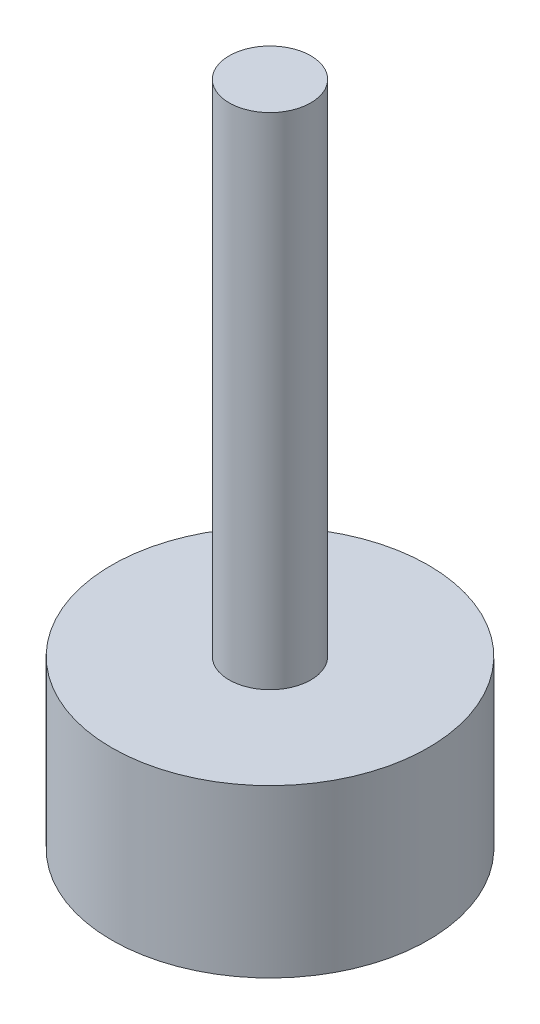
ISO-10303-21;
HEADER;
FILE_DESCRIPTION(('STEP AP214'),'2;1');
FILE_NAME('part.step','',(''),(''),'','','');
FILE_SCHEMA(('AUTOMOTIVE_DESIGN { 1 0 10303 214 1 1 1 1 }'));
ENDSEC;
DATA;
#1=APPLICATION_CONTEXT('core data for automotive mechanical design processes');
#2=APPLICATION_PROTOCOL_DEFINITION('international standard','automotive_design',2000,#1);
#3=PRODUCT_CONTEXT('',#1,'mechanical');
#4=PRODUCT('Part','Part','',(#3));
#5=PRODUCT_RELATED_PRODUCT_CATEGORY('part','',(#4));
#6=PRODUCT_DEFINITION_FORMATION('','',#4);
#7=PRODUCT_DEFINITION_CONTEXT('part definition',#1,'design');
#8=PRODUCT_DEFINITION('design','',#6,#7);
#9=PRODUCT_DEFINITION_SHAPE('','',#8);
#10=(LENGTH_UNIT() NAMED_UNIT(*) SI_UNIT(.MILLI.,.METRE.));
#11=(NAMED_UNIT(*) PLANE_ANGLE_UNIT() SI_UNIT($,.RADIAN.));
#12=(NAMED_UNIT(*) SI_UNIT($,.STERADIAN.) SOLID_ANGLE_UNIT());
#13=UNCERTAINTY_MEASURE_WITH_UNIT(LENGTH_MEASURE(1.E-05),#10,'distance_accuracy_value','');
#14=(GEOMETRIC_REPRESENTATION_CONTEXT(3) GLOBAL_UNCERTAINTY_ASSIGNED_CONTEXT((#13)) GLOBAL_UNIT_ASSIGNED_CONTEXT((#10,
#11,#12)) REPRESENTATION_CONTEXT('',''));
#15=CARTESIAN_POINT('',(0.,0.,0.));
#16=DIRECTION('',(0.,0.,1.));
#17=DIRECTION('',(1.,0.,0.));
#18=AXIS2_PLACEMENT_3D('',#15,#16,#17);
#19=CARTESIAN_POINT('',(0.,12.7,0.));
#20=DIRECTION('',(0.,-1.,0.));
#21=DIRECTION('',(0.,0.,-1.));
#22=AXIS2_PLACEMENT_3D('',#19,#20,#21);
#23=CYLINDRICAL_SURFACE('',#22,12.065);
#24=CARTESIAN_POINT('',(0.,12.7,0.));
#25=DIRECTION('',(0.,1.,0.));
#26=DIRECTION('',(0.,0.,1.));
#27=AXIS2_PLACEMENT_3D('',#24,#25,#26);
#28=CIRCLE('',#27,12.065);
#29=CARTESIAN_POINT('',(0.,12.7,12.065));
#30=VERTEX_POINT('',#29);
#31=EDGE_CURVE('E51',#30,#30,#28,.T.);
#32=ORIENTED_EDGE('',*,*,#31,.F.);
#33=EDGE_LOOP('',(#32));
#34=FACE_BOUND('',#33,.T.);
#35=CARTESIAN_POINT('',(0.,0.,0.));
#36=DIRECTION('',(0.,1.,0.));
#37=DIRECTION('',(0.,0.,1.));
#38=AXIS2_PLACEMENT_3D('',#35,#36,#37);
#39=CIRCLE('',#38,12.065);
#40=CARTESIAN_POINT('',(0.,0.,12.065));
#41=VERTEX_POINT('',#40);
#42=EDGE_CURVE('E46',#41,#41,#39,.T.);
#43=ORIENTED_EDGE('',*,*,#42,.T.);
#44=EDGE_LOOP('',(#43));
#45=FACE_BOUND('',#44,.T.);
#46=ADVANCED_FACE('F43',(#34,#45),#23,.T.);
#47=CARTESIAN_POINT('',(0.,12.7,0.));
#48=DIRECTION('',(0.,1.,0.));
#49=DIRECTION('',(0.,0.,1.));
#50=AXIS2_PLACEMENT_3D('',#47,#48,#49);
#51=PLANE('',#50);
#52=CARTESIAN_POINT('',(0.,12.7,0.));
#53=DIRECTION('',(0.,1.,0.));
#54=DIRECTION('',(0.,0.,1.));
#55=AXIS2_PLACEMENT_3D('',#52,#53,#54);
#56=CIRCLE('',#55,3.1115);
#57=CARTESIAN_POINT('',(0.,12.7,-3.1115));
#58=VERTEX_POINT('',#57);
#59=EDGE_CURVE('E10',#58,#58,#56,.T.);
#60=ORIENTED_EDGE('',*,*,#59,.F.);
#61=EDGE_LOOP('',(#60));
#62=FACE_BOUND('',#61,.T.);
#63=ORIENTED_EDGE('',*,*,#31,.T.);
#64=EDGE_LOOP('',(#63));
#65=FACE_BOUND('',#64,.T.);
#66=ADVANCED_FACE('F71',(#62,#65),#51,.T.);
#67=CARTESIAN_POINT('',(0.,0.,0.));
#68=DIRECTION('',(0.,1.,0.));
#69=DIRECTION('',(0.,0.,1.));
#70=AXIS2_PLACEMENT_3D('',#67,#68,#69);
#71=PLANE('',#70);
#72=ORIENTED_EDGE('',*,*,#42,.F.);
#73=EDGE_LOOP('',(#72));
#74=FACE_BOUND('',#73,.T.);
#75=ADVANCED_FACE('F68',(#74),#71,.F.);
#76=CARTESIAN_POINT('',(0.,50.8,0.));
#77=DIRECTION('',(0.,-1.,0.));
#78=DIRECTION('',(0.,0.,-1.));
#79=AXIS2_PLACEMENT_3D('',#76,#77,#78);
#80=CYLINDRICAL_SURFACE('',#79,3.1115);
#81=CARTESIAN_POINT('',(0.,50.8,0.));
#82=DIRECTION('',(0.,1.,0.));
#83=DIRECTION('',(0.,0.,1.));
#84=AXIS2_PLACEMENT_3D('',#81,#82,#83);
#85=CIRCLE('',#84,3.1115);
#86=CARTESIAN_POINT('',(0.,50.8,-3.1115));
#87=VERTEX_POINT('',#86);
#88=EDGE_CURVE('E58',#87,#87,#85,.T.);
#89=CARTESIAN_POINT('',(0.,50.8,-3.1115));
#90=CARTESIAN_POINT('',(0.,50.403125,-3.1115));
#91=CARTESIAN_POINT('',(0.,50.00625,-3.1115));
#92=CARTESIAN_POINT('',(0.,49.2125,-3.1115));
#93=CARTESIAN_POINT('',(0.,48.815625,-3.1115));
#94=CARTESIAN_POINT('',(0.,48.021875,-3.1115));
#95=CARTESIAN_POINT('',(0.,47.625,-3.1115));
#96=CARTESIAN_POINT('',(0.,46.83125,-3.1115));
#97=CARTESIAN_POINT('',(0.,46.434375,-3.1115));
#98=CARTESIAN_POINT('',(0.,45.640625,-3.1115));
#99=CARTESIAN_POINT('',(0.,45.24375,-3.1115));
#100=CARTESIAN_POINT('',(0.,44.45,-3.1115));
#101=CARTESIAN_POINT('',(0.,44.053125,-3.1115));
#102=CARTESIAN_POINT('',(0.,43.259375,-3.1115));
#103=CARTESIAN_POINT('',(0.,42.8625,-3.1115));
#104=CARTESIAN_POINT('',(0.,42.06875,-3.1115));
#105=CARTESIAN_POINT('',(0.,41.671875,-3.1115));
#106=CARTESIAN_POINT('',(0.,40.878125,-3.1115));
#107=CARTESIAN_POINT('',(0.,40.48125,-3.1115));
#108=CARTESIAN_POINT('',(0.,39.6875,-3.1115));
#109=CARTESIAN_POINT('',(0.,39.290625,-3.1115));
#110=CARTESIAN_POINT('',(0.,38.496875,-3.1115));
#111=CARTESIAN_POINT('',(0.,38.1,-3.1115));
#112=CARTESIAN_POINT('',(0.,37.30625,-3.1115));
#113=CARTESIAN_POINT('',(0.,36.909375,-3.1115));
#114=CARTESIAN_POINT('',(0.,36.115625,-3.1115));
#115=CARTESIAN_POINT('',(0.,35.71875,-3.1115));
#116=CARTESIAN_POINT('',(0.,34.925,-3.1115));
#117=CARTESIAN_POINT('',(0.,34.528125,-3.1115));
#118=CARTESIAN_POINT('',(0.,33.734375,-3.1115));
#119=CARTESIAN_POINT('',(0.,33.3375,-3.1115));
#120=CARTESIAN_POINT('',(0.,32.54375,-3.1115));
#121=CARTESIAN_POINT('',(0.,32.146875,-3.1115));
#122=CARTESIAN_POINT('',(0.,31.353125,-3.1115));
#123=CARTESIAN_POINT('',(0.,30.95625,-3.1115));
#124=CARTESIAN_POINT('',(0.,30.1625,-3.1115));
#125=CARTESIAN_POINT('',(0.,29.765625,-3.1115));
#126=CARTESIAN_POINT('',(0.,28.971875,-3.1115));
#127=CARTESIAN_POINT('',(0.,28.575,-3.1115));
#128=CARTESIAN_POINT('',(0.,27.78125,-3.1115));
#129=CARTESIAN_POINT('',(0.,27.384375,-3.1115));
#130=CARTESIAN_POINT('',(0.,26.590625,-3.1115));
#131=CARTESIAN_POINT('',(0.,26.19375,-3.1115));
#132=CARTESIAN_POINT('',(0.,25.4,-3.1115));
#133=CARTESIAN_POINT('',(0.,25.003125,-3.1115));
#134=CARTESIAN_POINT('',(0.,24.209375,-3.1115));
#135=CARTESIAN_POINT('',(0.,23.8125,-3.1115));
#136=CARTESIAN_POINT('',(0.,23.01875,-3.1115));
#137=CARTESIAN_POINT('',(0.,22.621875,-3.1115));
#138=CARTESIAN_POINT('',(0.,21.828125,-3.1115));
#139=CARTESIAN_POINT('',(0.,21.43125,-3.1115));
#140=CARTESIAN_POINT('',(0.,20.6375,-3.1115));
#141=CARTESIAN_POINT('',(0.,20.240625,-3.1115));
#142=CARTESIAN_POINT('',(0.,19.446875,-3.1115));
#143=CARTESIAN_POINT('',(0.,19.05,-3.1115));
#144=CARTESIAN_POINT('',(0.,18.25625,-3.1115));
#145=CARTESIAN_POINT('',(0.,17.859375,-3.1115));
#146=CARTESIAN_POINT('',(0.,17.065625,-3.1115));
#147=CARTESIAN_POINT('',(0.,16.66875,-3.1115));
#148=CARTESIAN_POINT('',(0.,15.875,-3.1115));
#149=CARTESIAN_POINT('',(0.,15.478125,-3.1115));
#150=CARTESIAN_POINT('',(0.,14.684375,-3.1115));
#151=CARTESIAN_POINT('',(0.,14.2875,-3.1115));
#152=CARTESIAN_POINT('',(0.,13.49375,-3.1115));
#153=CARTESIAN_POINT('',(0.,13.096875,-3.1115));
#154=CARTESIAN_POINT('',(0.,12.7,-3.1115));
#155=B_SPLINE_CURVE_WITH_KNOTS('',3,(#89,#90,#91,#92,#93,#94,#95,#96,#97,#98,#99,#100,#101,#102,
#103,#104,#105,#106,#107,#108,#109,#110,#111,#112,#113,#114,#115,#116,#117,#118,#119,#120,#121,
#122,#123,#124,#125,#126,#127,#128,#129,#130,#131,#132,#133,#134,#135,#136,#137,#138,#139,#140,
#141,#142,#143,#144,#145,#146,#147,#148,#149,#150,#151,#152,#153,#154),.UNSPECIFIED.,.F.,.F.,(4,
2,2,2,2,2,2,2,2,2,2,2,2,2,2,2,2,2,2,2,2,2,2,2,2,2,2,2,2,2,2,2,4),(0.,1.190625,2.38125,3.571875,
4.7625,5.953125,7.14375,8.334375,9.52500000000001,10.715625,11.90625,13.096875,14.2875,
15.478125,16.66875,17.859375,19.05,20.240625,21.43125,22.621875,23.8125,25.003125,26.19375,
27.384375,28.575,29.765625,30.95625,32.146875,33.3375,34.528125,35.71875,36.909375,38.1),.UNSPECIFIED.);
#156=EDGE_CURVE('BSEAM70',#87,#58,#155,.T.);
#157=ORIENTED_EDGE('',*,*,#88,.F.);
#158=ORIENTED_EDGE('',*,*,#59,.T.);
#159=ORIENTED_EDGE('',*,*,#156,.T.);
#160=ORIENTED_EDGE('',*,*,#156,.F.);
#161=EDGE_LOOP('',(#157,#159,#158,#160));
#162=FACE_BOUND('',#161,.T.);
#163=ADVANCED_FACE('F70',(#162),#80,.T.);
#164=CARTESIAN_POINT('',(0.,50.8,0.));
#165=DIRECTION('',(0.,1.,0.));
#166=DIRECTION('',(0.,0.,1.));
#167=AXIS2_PLACEMENT_3D('',#164,#165,#166);
#168=PLANE('',#167);
#169=ORIENTED_EDGE('',*,*,#88,.T.);
#170=EDGE_LOOP('',(#169));
#171=FACE_BOUND('',#170,.T.);
#172=ADVANCED_FACE('F77',(#171),#168,.T.);
#173=CLOSED_SHELL('',(#46,#66,#75,#163,#172));
#174=MANIFOLD_SOLID_BREP('B2',#173);
#175=ADVANCED_BREP_SHAPE_REPRESENTATION('',(#18,#174),#14);
#176=SHAPE_DEFINITION_REPRESENTATION(#9,#175);
ENDSEC;
END-ISO-10303-21;
